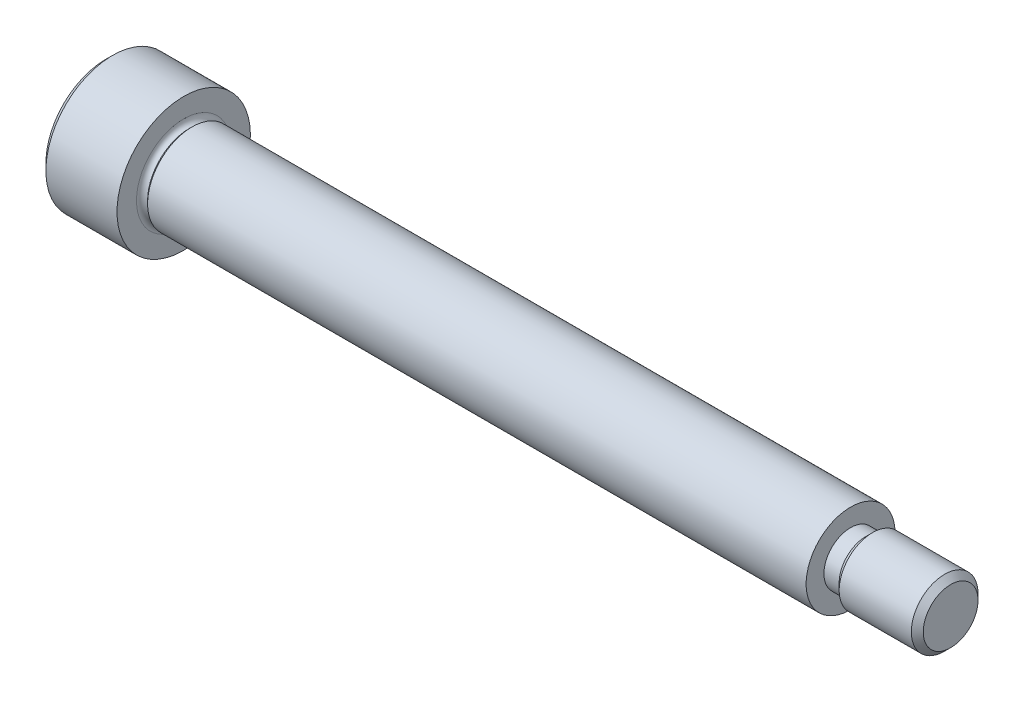
ISO-10303-21;
HEADER;
FILE_DESCRIPTION(('STEP AP214'),'2;1');
FILE_NAME('part.step','',(''),(''),'','','');
FILE_SCHEMA(('AUTOMOTIVE_DESIGN { 1 0 10303 214 1 1 1 1 }'));
ENDSEC;
DATA;
#1=APPLICATION_CONTEXT('core data for automotive mechanical design processes');
#2=APPLICATION_PROTOCOL_DEFINITION('international standard','automotive_design',2000,#1);
#3=PRODUCT_CONTEXT('',#1,'mechanical');
#4=PRODUCT('Part','Part','',(#3));
#5=PRODUCT_RELATED_PRODUCT_CATEGORY('part','',(#4));
#6=PRODUCT_DEFINITION_FORMATION('','',#4);
#7=PRODUCT_DEFINITION_CONTEXT('part definition',#1,'design');
#8=PRODUCT_DEFINITION('design','',#6,#7);
#9=PRODUCT_DEFINITION_SHAPE('','',#8);
#10=(LENGTH_UNIT() NAMED_UNIT(*) SI_UNIT(.MILLI.,.METRE.));
#11=(NAMED_UNIT(*) PLANE_ANGLE_UNIT() SI_UNIT($,.RADIAN.));
#12=(NAMED_UNIT(*) SI_UNIT($,.STERADIAN.) SOLID_ANGLE_UNIT());
#13=UNCERTAINTY_MEASURE_WITH_UNIT(LENGTH_MEASURE(1.E-05),#10,'distance_accuracy_value','');
#14=(GEOMETRIC_REPRESENTATION_CONTEXT(3) GLOBAL_UNCERTAINTY_ASSIGNED_CONTEXT((#13)) GLOBAL_UNIT_ASSIGNED_CONTEXT((#10,
#11,#12)) REPRESENTATION_CONTEXT('',''));
#15=CARTESIAN_POINT('',(0.,0.,0.));
#16=DIRECTION('',(0.,0.,1.));
#17=DIRECTION('',(1.,0.,0.));
#18=AXIS2_PLACEMENT_3D('',#15,#16,#17);
#19=CARTESIAN_POINT('',(-7.00000000006185,0.,0.));
#20=DIRECTION('',(-1.,0.,0.));
#21=DIRECTION('',(0.,0.,1.));
#22=AXIS2_PLACEMENT_3D('',#19,#20,#21);
#23=CONICAL_SURFACE('',#22,4.99999999999545,1.04719755118672);
#24=CARTESIAN_POINT('',(-4.1132486540505,0.,0.));
#25=VERTEX_POINT('',#24);
#26=VERTEX_LOOP('',#25);
#27=FACE_BOUND('',#26,.T.);
#28=CARTESIAN_POINT('',(-7.00000000006185,0.,0.));
#29=DIRECTION('',(-1.,0.,0.));
#30=DIRECTION('',(0.,0.,1.));
#31=AXIS2_PLACEMENT_3D('',#28,#29,#30);
#32=CIRCLE('',#31,4.99999999999545);
#33=CARTESIAN_POINT('',(-7.00000000003092,-4.33012701892023,2.49999999999886));
#34=VERTEX_POINT('',#33);
#35=CARTESIAN_POINT('',(-7.00000000003092,0.,4.99999999999773));
#36=VERTEX_POINT('',#35);
#37=EDGE_CURVE('E88',#34,#36,#32,.T.);
#38=ORIENTED_EDGE('',*,*,#37,.T.);
#39=CARTESIAN_POINT('',(-7.00000000006185,0.,0.));
#40=DIRECTION('',(-1.,0.,0.));
#41=DIRECTION('',(0.,0.,1.));
#42=AXIS2_PLACEMENT_3D('',#39,#40,#41);
#43=CIRCLE('',#42,4.99999999999545);
#44=CARTESIAN_POINT('',(-7.00000000003092,4.33012701892023,2.49999999999886));
#45=VERTEX_POINT('',#44);
#46=EDGE_CURVE('E19',#36,#45,#43,.T.);
#47=ORIENTED_EDGE('',*,*,#46,.T.);
#48=CARTESIAN_POINT('',(-7.00000000006185,0.,0.));
#49=DIRECTION('',(-1.,0.,0.));
#50=DIRECTION('',(0.,0.,1.));
#51=AXIS2_PLACEMENT_3D('',#48,#49,#50);
#52=CIRCLE('',#51,4.99999999999545);
#53=CARTESIAN_POINT('',(-7.00000000003092,4.33012701892023,-2.49999999999886));
#54=VERTEX_POINT('',#53);
#55=EDGE_CURVE('E93',#45,#54,#52,.T.);
#56=ORIENTED_EDGE('',*,*,#55,.T.);
#57=CARTESIAN_POINT('',(-7.00000000006185,0.,0.));
#58=DIRECTION('',(-1.,0.,0.));
#59=DIRECTION('',(0.,0.,1.));
#60=AXIS2_PLACEMENT_3D('',#57,#58,#59);
#61=CIRCLE('',#60,4.99999999999545);
#62=CARTESIAN_POINT('',(-7.00000000003092,0.,-4.99999999999773));
#63=VERTEX_POINT('',#62);
#64=EDGE_CURVE('E105',#54,#63,#61,.T.);
#65=ORIENTED_EDGE('',*,*,#64,.T.);
#66=CARTESIAN_POINT('',(-7.00000000006185,0.,0.));
#67=DIRECTION('',(-1.,0.,0.));
#68=DIRECTION('',(0.,0.,1.));
#69=AXIS2_PLACEMENT_3D('',#66,#67,#68);
#70=CIRCLE('',#69,4.99999999999545);
#71=CARTESIAN_POINT('',(-7.00000000003092,-4.33012701892023,-2.49999999999886));
#72=VERTEX_POINT('',#71);
#73=EDGE_CURVE('E113',#63,#72,#70,.T.);
#74=ORIENTED_EDGE('',*,*,#73,.T.);
#75=CARTESIAN_POINT('',(-7.00000000006185,0.,0.));
#76=DIRECTION('',(-1.,0.,0.));
#77=DIRECTION('',(0.,0.,1.));
#78=AXIS2_PLACEMENT_3D('',#75,#76,#77);
#79=CIRCLE('',#78,4.99999999999545);
#80=EDGE_CURVE('E207',#72,#34,#79,.T.);
#81=ORIENTED_EDGE('',*,*,#80,.T.);
#82=EDGE_LOOP('',(#38,#47,#56,#65,#74,#81));
#83=FACE_BOUND('',#82,.T.);
#84=ADVANCED_FACE('F15',(#27,#83),#23,.F.);
#85=CARTESIAN_POINT('',(-7.,0.,0.));
#86=DIRECTION('',(1.,0.,0.));
#87=DIRECTION('',(0.,0.,-1.));
#88=AXIS2_PLACEMENT_3D('',#85,#86,#87);
#89=PLANE('',#88);
#90=DIRECTION('',(0.,-0.5,0.866025403784439));
#91=VECTOR('',#90,1.);
#92=CARTESIAN_POINT('',(-7.,2.88675134594813,5.));
#93=LINE('',#92,#91);
#94=CARTESIAN_POINT('',(-7.00000000000125,2.88675134594813,5.));
#95=VERTEX_POINT('',#94);
#96=EDGE_CURVE('E98',#95,#45,#93,.F.);
#97=ORIENTED_EDGE('',*,*,#96,.T.);
#98=ORIENTED_EDGE('',*,*,#46,.F.);
#99=DIRECTION('',(0.,1.,0.));
#100=VECTOR('',#99,1.);
#101=CARTESIAN_POINT('',(-7.0000000000025,-2.88675134594813,5.));
#102=LINE('',#101,#100);
#103=EDGE_CURVE('E100',#36,#95,#102,.T.);
#104=ORIENTED_EDGE('',*,*,#103,.T.);
#105=EDGE_LOOP('',(#97,#98,#104));
#106=FACE_BOUND('',#105,.T.);
#107=ADVANCED_FACE('F99',(#106),#89,.F.);
#108=CARTESIAN_POINT('',(-7.,0.,0.));
#109=DIRECTION('',(1.,0.,0.));
#110=DIRECTION('',(0.,0.,-1.));
#111=AXIS2_PLACEMENT_3D('',#108,#109,#110);
#112=PLANE('',#111);
#113=DIRECTION('',(0.,1.,0.));
#114=VECTOR('',#113,1.);
#115=CARTESIAN_POINT('',(-7.,-2.88675134594813,5.));
#116=LINE('',#115,#114);
#117=CARTESIAN_POINT('',(-7.00000000000125,-2.88675134595108,5.));
#118=VERTEX_POINT('',#117);
#119=EDGE_CURVE('E118',#118,#36,#116,.T.);
#120=ORIENTED_EDGE('',*,*,#119,.T.);
#121=ORIENTED_EDGE('',*,*,#37,.F.);
#122=DIRECTION('',(0.,-0.5,-0.866025403784439));
#123=VECTOR('',#122,1.);
#124=CARTESIAN_POINT('',(-7.0000000000025,-5.77350269189626,0.));
#125=LINE('',#124,#123);
#126=EDGE_CURVE('E163',#34,#118,#125,.F.);
#127=ORIENTED_EDGE('',*,*,#126,.T.);
#128=EDGE_LOOP('',(#120,#121,#127));
#129=FACE_BOUND('',#128,.T.);
#130=ADVANCED_FACE('F218',(#129),#112,.F.);
#131=CARTESIAN_POINT('',(-7.,0.,0.));
#132=DIRECTION('',(1.,0.,0.));
#133=DIRECTION('',(0.,0.,-1.));
#134=AXIS2_PLACEMENT_3D('',#131,#132,#133);
#135=PLANE('',#134);
#136=DIRECTION('',(0.,-0.5,-0.866025403784439));
#137=VECTOR('',#136,1.);
#138=CARTESIAN_POINT('',(-7.,-5.77350269189626,0.));
#139=LINE('',#138,#137);
#140=CARTESIAN_POINT('',(-7.00000000000125,-5.77350269189626,0.));
#141=VERTEX_POINT('',#140);
#142=EDGE_CURVE('E160',#141,#34,#139,.F.);
#143=ORIENTED_EDGE('',*,*,#142,.T.);
#144=ORIENTED_EDGE('',*,*,#80,.F.);
#145=DIRECTION('',(0.,0.5,-0.866025403784439));
#146=VECTOR('',#145,1.);
#147=CARTESIAN_POINT('',(-7.0000000000025,-2.88675134594813,-5.));
#148=LINE('',#147,#146);
#149=EDGE_CURVE('E149',#72,#141,#148,.F.);
#150=ORIENTED_EDGE('',*,*,#149,.T.);
#151=EDGE_LOOP('',(#143,#144,#150));
#152=FACE_BOUND('',#151,.T.);
#153=ADVANCED_FACE('F213',(#152),#135,.F.);
#154=CARTESIAN_POINT('',(-7.,0.,0.));
#155=DIRECTION('',(1.,0.,0.));
#156=DIRECTION('',(0.,0.,-1.));
#157=AXIS2_PLACEMENT_3D('',#154,#155,#156);
#158=PLANE('',#157);
#159=DIRECTION('',(0.,0.5,-0.866025403784439));
#160=VECTOR('',#159,1.);
#161=CARTESIAN_POINT('',(-7.,-2.88675134594813,-5.));
#162=LINE('',#161,#160);
#163=CARTESIAN_POINT('',(-7.00000000000125,-2.88675134594813,-5.));
#164=VERTEX_POINT('',#163);
#165=EDGE_CURVE('E146',#164,#72,#162,.F.);
#166=ORIENTED_EDGE('',*,*,#165,.T.);
#167=ORIENTED_EDGE('',*,*,#73,.F.);
#168=DIRECTION('',(0.,1.,0.));
#169=VECTOR('',#168,1.);
#170=CARTESIAN_POINT('',(-7.0000000000025,2.88675134594813,-5.));
#171=LINE('',#170,#169);
#172=EDGE_CURVE('E140',#63,#164,#171,.F.);
#173=ORIENTED_EDGE('',*,*,#172,.T.);
#174=EDGE_LOOP('',(#166,#167,#173));
#175=FACE_BOUND('',#174,.T.);
#176=ADVANCED_FACE('F264',(#175),#158,.F.);
#177=CARTESIAN_POINT('',(-7.,0.,0.));
#178=DIRECTION('',(1.,0.,0.));
#179=DIRECTION('',(0.,0.,-1.));
#180=AXIS2_PLACEMENT_3D('',#177,#178,#179);
#181=PLANE('',#180);
#182=DIRECTION('',(0.,0.5,0.866025403784439));
#183=VECTOR('',#182,1.);
#184=CARTESIAN_POINT('',(-7.,5.77350269189626,0.));
#185=LINE('',#184,#183);
#186=CARTESIAN_POINT('',(-7.00000000000083,5.77350269189626,0.));
#187=VERTEX_POINT('',#186);
#188=EDGE_CURVE('E111',#187,#54,#185,.F.);
#189=ORIENTED_EDGE('',*,*,#188,.T.);
#190=ORIENTED_EDGE('',*,*,#55,.F.);
#191=DIRECTION('',(0.,-0.5,0.866025403784439));
#192=VECTOR('',#191,1.);
#193=CARTESIAN_POINT('',(-7.0000000000025,2.88675134594813,5.));
#194=LINE('',#193,#192);
#195=EDGE_CURVE('E104',#45,#187,#194,.F.);
#196=ORIENTED_EDGE('',*,*,#195,.T.);
#197=EDGE_LOOP('',(#189,#190,#196));
#198=FACE_BOUND('',#197,.T.);
#199=ADVANCED_FACE('F108',(#198),#181,.F.);
#200=CARTESIAN_POINT('',(-7.,0.,0.));
#201=DIRECTION('',(1.,0.,0.));
#202=DIRECTION('',(0.,0.,-1.));
#203=AXIS2_PLACEMENT_3D('',#200,#201,#202);
#204=PLANE('',#203);
#205=DIRECTION('',(0.,1.,0.));
#206=VECTOR('',#205,1.);
#207=CARTESIAN_POINT('',(-7.,2.88675134594813,-5.));
#208=LINE('',#207,#206);
#209=CARTESIAN_POINT('',(-7.00000000000125,2.88675134595108,-5.));
#210=VERTEX_POINT('',#209);
#211=EDGE_CURVE('E143',#210,#63,#208,.F.);
#212=ORIENTED_EDGE('',*,*,#211,.T.);
#213=ORIENTED_EDGE('',*,*,#64,.F.);
#214=DIRECTION('',(0.,0.5,0.866025403784439));
#215=VECTOR('',#214,1.);
#216=CARTESIAN_POINT('',(-7.0000000000025,5.77350269189626,0.));
#217=LINE('',#216,#215);
#218=EDGE_CURVE('E248',#54,#210,#217,.F.);
#219=ORIENTED_EDGE('',*,*,#218,.T.);
#220=EDGE_LOOP('',(#212,#213,#219));
#221=FACE_BOUND('',#220,.T.);
#222=ADVANCED_FACE('F261',(#221),#204,.F.);
#223=CARTESIAN_POINT('',(-14.,2.88675134594813,5.));
#224=DIRECTION('',(0.,0.866025403784439,0.5));
#225=DIRECTION('',(0.,-0.5,0.866025403784439));
#226=AXIS2_PLACEMENT_3D('',#223,#224,#225);
#227=PLANE('',#226);
#228=ORIENTED_EDGE('',*,*,#195,.F.);
#229=ORIENTED_EDGE('',*,*,#96,.F.);
#230=DIRECTION('',(1.,0.,0.));
#231=VECTOR('',#230,1.);
#232=CARTESIAN_POINT('',(-14.,2.88675134594813,5.));
#233=LINE('',#232,#231);
#234=CARTESIAN_POINT('',(-14.,2.88675134594813,5.));
#235=VERTEX_POINT('',#234);
#236=EDGE_CURVE('E164',#95,#235,#233,.F.);
#237=ORIENTED_EDGE('',*,*,#236,.T.);
#238=DIRECTION('',(0.,-0.5,0.866025403784439));
#239=VECTOR('',#238,1.);
#240=CARTESIAN_POINT('',(-14.,5.77350269189626,0.));
#241=LINE('',#240,#239);
#242=CARTESIAN_POINT('',(-14.,5.77350269189626,0.));
#243=VERTEX_POINT('',#242);
#244=EDGE_CURVE('E127',#243,#235,#241,.T.);
#245=ORIENTED_EDGE('',*,*,#244,.F.);
#246=DIRECTION('',(1.,0.,0.));
#247=VECTOR('',#246,1.);
#248=CARTESIAN_POINT('',(-14.,5.77350269189626,0.));
#249=LINE('',#248,#247);
#250=EDGE_CURVE('E117',#243,#187,#249,.T.);
#251=ORIENTED_EDGE('',*,*,#250,.T.);
#252=EDGE_LOOP('',(#228,#229,#237,#245,#251));
#253=FACE_BOUND('',#252,.T.);
#254=ADVANCED_FACE('F115',(#253),#227,.F.);
#255=CARTESIAN_POINT('',(-14.,-2.88675134594813,5.));
#256=DIRECTION('',(0.,0.,1.));
#257=DIRECTION('',(1.,0.,0.));
#258=AXIS2_PLACEMENT_3D('',#255,#256,#257);
#259=PLANE('',#258);
#260=ORIENTED_EDGE('',*,*,#103,.F.);
#261=ORIENTED_EDGE('',*,*,#119,.F.);
#262=DIRECTION('',(1.,0.,0.));
#263=VECTOR('',#262,1.);
#264=CARTESIAN_POINT('',(-14.,-2.88675134594813,5.));
#265=LINE('',#264,#263);
#266=CARTESIAN_POINT('',(-14.,-2.88675134594813,5.));
#267=VERTEX_POINT('',#266);
#268=EDGE_CURVE('E150',#118,#267,#265,.F.);
#269=ORIENTED_EDGE('',*,*,#268,.T.);
#270=DIRECTION('',(0.,1.,0.));
#271=VECTOR('',#270,1.);
#272=CARTESIAN_POINT('',(-14.,7.9,5.));
#273=LINE('',#272,#271);
#274=EDGE_CURVE('E130',#235,#267,#273,.F.);
#275=ORIENTED_EDGE('',*,*,#274,.F.);
#276=ORIENTED_EDGE('',*,*,#236,.F.);
#277=EDGE_LOOP('',(#260,#261,#269,#275,#276));
#278=FACE_BOUND('',#277,.T.);
#279=ADVANCED_FACE('F228',(#278),#259,.F.);
#280=CARTESIAN_POINT('',(-14.,-5.77350269189626,0.));
#281=DIRECTION('',(0.,-0.866025403784439,0.5));
#282=DIRECTION('',(0.,-0.5,-0.866025403784439));
#283=AXIS2_PLACEMENT_3D('',#280,#281,#282);
#284=PLANE('',#283);
#285=ORIENTED_EDGE('',*,*,#126,.F.);
#286=ORIENTED_EDGE('',*,*,#142,.F.);
#287=DIRECTION('',(1.,0.,0.));
#288=VECTOR('',#287,1.);
#289=CARTESIAN_POINT('',(-14.,-5.77350269189626,0.));
#290=LINE('',#289,#288);
#291=CARTESIAN_POINT('',(-14.,-5.77350269189626,0.));
#292=VERTEX_POINT('',#291);
#293=EDGE_CURVE('E157',#141,#292,#290,.F.);
#294=ORIENTED_EDGE('',*,*,#293,.T.);
#295=DIRECTION('',(0.,-0.5,-0.866025403784439));
#296=VECTOR('',#295,1.);
#297=CARTESIAN_POINT('',(-14.,-2.88675134594813,5.));
#298=LINE('',#297,#296);
#299=EDGE_CURVE('E224',#267,#292,#298,.T.);
#300=ORIENTED_EDGE('',*,*,#299,.F.);
#301=ORIENTED_EDGE('',*,*,#268,.F.);
#302=EDGE_LOOP('',(#285,#286,#294,#300,#301));
#303=FACE_BOUND('',#302,.T.);
#304=ADVANCED_FACE('F221',(#303),#284,.F.);
#305=CARTESIAN_POINT('',(-14.,-2.88675134594813,-5.));
#306=DIRECTION('',(0.,-0.866025403784439,-0.5));
#307=DIRECTION('',(0.,0.5,-0.866025403784439));
#308=AXIS2_PLACEMENT_3D('',#305,#306,#307);
#309=PLANE('',#308);
#310=ORIENTED_EDGE('',*,*,#149,.F.);
#311=ORIENTED_EDGE('',*,*,#165,.F.);
#312=DIRECTION('',(-1.,0.,0.));
#313=VECTOR('',#312,1.);
#314=CARTESIAN_POINT('',(-14.,-2.88675134594813,-5.));
#315=LINE('',#314,#313);
#316=CARTESIAN_POINT('',(-14.,-2.88675134594813,-5.));
#317=VERTEX_POINT('',#316);
#318=EDGE_CURVE('E142',#164,#317,#315,.T.);
#319=ORIENTED_EDGE('',*,*,#318,.T.);
#320=DIRECTION('',(0.,0.5,-0.866025403784439));
#321=VECTOR('',#320,1.);
#322=CARTESIAN_POINT('',(-14.,-5.77350269189626,0.));
#323=LINE('',#322,#321);
#324=EDGE_CURVE('E238',#292,#317,#323,.T.);
#325=ORIENTED_EDGE('',*,*,#324,.F.);
#326=ORIENTED_EDGE('',*,*,#293,.F.);
#327=EDGE_LOOP('',(#310,#311,#319,#325,#326));
#328=FACE_BOUND('',#327,.T.);
#329=ADVANCED_FACE('F268',(#328),#309,.F.);
#330=CARTESIAN_POINT('',(-14.,2.88675134594813,-5.));
#331=DIRECTION('',(0.,0.,-1.));
#332=DIRECTION('',(-1.,0.,0.));
#333=AXIS2_PLACEMENT_3D('',#330,#331,#332);
#334=PLANE('',#333);
#335=ORIENTED_EDGE('',*,*,#172,.F.);
#336=ORIENTED_EDGE('',*,*,#211,.F.);
#337=DIRECTION('',(1.,0.,0.));
#338=VECTOR('',#337,1.);
#339=CARTESIAN_POINT('',(-14.,2.88675134594813,-5.));
#340=LINE('',#339,#338);
#341=CARTESIAN_POINT('',(-14.,2.88675134594813,-5.));
#342=VERTEX_POINT('',#341);
#343=EDGE_CURVE('E34',#210,#342,#340,.F.);
#344=ORIENTED_EDGE('',*,*,#343,.T.);
#345=DIRECTION('',(0.,1.,0.));
#346=VECTOR('',#345,1.);
#347=CARTESIAN_POINT('',(-14.,7.9,-5.));
#348=LINE('',#347,#346);
#349=EDGE_CURVE('E137',#317,#342,#348,.T.);
#350=ORIENTED_EDGE('',*,*,#349,.F.);
#351=ORIENTED_EDGE('',*,*,#318,.F.);
#352=EDGE_LOOP('',(#335,#336,#344,#350,#351));
#353=FACE_BOUND('',#352,.T.);
#354=ADVANCED_FACE('F266',(#353),#334,.F.);
#355=CARTESIAN_POINT('',(-14.,5.77350269189626,0.));
#356=DIRECTION('',(0.,0.866025403784439,-0.5));
#357=DIRECTION('',(0.,0.5,0.866025403784439));
#358=AXIS2_PLACEMENT_3D('',#355,#356,#357);
#359=PLANE('',#358);
#360=ORIENTED_EDGE('',*,*,#218,.F.);
#361=ORIENTED_EDGE('',*,*,#188,.F.);
#362=ORIENTED_EDGE('',*,*,#250,.F.);
#363=DIRECTION('',(0.,0.5,0.866025403784439));
#364=VECTOR('',#363,1.);
#365=CARTESIAN_POINT('',(-14.,2.88675134594813,-5.));
#366=LINE('',#365,#364);
#367=EDGE_CURVE('E133',#342,#243,#366,.T.);
#368=ORIENTED_EDGE('',*,*,#367,.F.);
#369=ORIENTED_EDGE('',*,*,#343,.F.);
#370=EDGE_LOOP('',(#360,#361,#362,#368,#369));
#371=FACE_BOUND('',#370,.T.);
#372=ADVANCED_FACE('F232',(#371),#359,.F.);
#373=CARTESIAN_POINT('',(-14.,7.9,0.));
#374=DIRECTION('',(-1.,0.,0.));
#375=DIRECTION('',(0.,0.,1.));
#376=AXIS2_PLACEMENT_3D('',#373,#374,#375);
#377=PLANE('',#376);
#378=ORIENTED_EDGE('',*,*,#349,.T.);
#379=ORIENTED_EDGE('',*,*,#367,.T.);
#380=ORIENTED_EDGE('',*,*,#244,.T.);
#381=ORIENTED_EDGE('',*,*,#274,.T.);
#382=ORIENTED_EDGE('',*,*,#299,.T.);
#383=ORIENTED_EDGE('',*,*,#324,.T.);
#384=EDGE_LOOP('',(#378,#379,#380,#381,#382,#383));
#385=FACE_BOUND('',#384,.T.);
#386=CARTESIAN_POINT('',(-14.,0.,0.));
#387=DIRECTION('',(1.,0.,0.));
#388=DIRECTION('',(0.,0.,-1.));
#389=AXIS2_PLACEMENT_3D('',#386,#387,#388);
#390=CIRCLE('',#389,10.8);
#391=CARTESIAN_POINT('',(-14.,0.,-10.8));
#392=VERTEX_POINT('',#391);
#393=EDGE_CURVE('E136',#392,#392,#390,.T.);
#394=ORIENTED_EDGE('',*,*,#393,.F.);
#395=EDGE_LOOP('',(#394));
#396=FACE_BOUND('',#395,.T.);
#397=ADVANCED_FACE('F234',(#385,#396),#377,.T.);
#398=CARTESIAN_POINT('',(138.,2.46325,0.));
#399=DIRECTION('',(1.,0.,0.));
#400=DIRECTION('',(0.,0.,-1.));
#401=AXIS2_PLACEMENT_3D('',#398,#399,#400);
#402=PLANE('',#401);
#403=CARTESIAN_POINT('',(137.999999999977,0.,0.));
#404=DIRECTION('',(-1.,0.,0.));
#405=DIRECTION('',(0.,0.,1.));
#406=AXIS2_PLACEMENT_3D('',#403,#404,#405);
#407=CIRCLE('',#406,4.92650000001049);
#408=CARTESIAN_POINT('',(137.999999999977,0.,4.92650000001049));
#409=VERTEX_POINT('',#408);
#410=EDGE_CURVE('E199',#409,#409,#407,.T.);
#411=ORIENTED_EDGE('',*,*,#410,.F.);
#412=EDGE_LOOP('',(#411));
#413=FACE_BOUND('',#412,.T.);
#414=ADVANCED_FACE('F323',(#413),#402,.T.);
#415=CARTESIAN_POINT('',(-12.8,0.,0.));
#416=DIRECTION('',(1.,0.,0.));
#417=DIRECTION('',(0.,0.,-1.));
#418=AXIS2_PLACEMENT_3D('',#415,#416,#417);
#419=CONICAL_SURFACE('',#418,12.,0.785398163397448);
#420=ORIENTED_EDGE('',*,*,#393,.T.);
#421=EDGE_LOOP('',(#420));
#422=FACE_BOUND('',#421,.T.);
#423=CARTESIAN_POINT('',(-12.8,0.,0.));
#424=DIRECTION('',(1.,0.,0.));
#425=DIRECTION('',(0.,0.,-1.));
#426=AXIS2_PLACEMENT_3D('',#423,#424,#425);
#427=CIRCLE('',#426,12.);
#428=CARTESIAN_POINT('',(-12.8,0.,-12.));
#429=VERTEX_POINT('',#428);
#430=EDGE_CURVE('E202',#429,#429,#427,.T.);
#431=ORIENTED_EDGE('',*,*,#430,.F.);
#432=EDGE_LOOP('',(#431));
#433=FACE_BOUND('',#432,.T.);
#434=ADVANCED_FACE('F319',(#422,#433),#419,.T.);
#435=CARTESIAN_POINT('',(136.926500000072,0.,0.));
#436=DIRECTION('',(-1.,0.,0.));
#437=DIRECTION('',(0.,0.,1.));
#438=AXIS2_PLACEMENT_3D('',#435,#436,#437);
#439=CONICAL_SURFACE('',#438,5.99999999991496,0.785398163397448);
#440=CARTESIAN_POINT('',(136.9265,0.,0.));
#441=DIRECTION('',(1.,0.,0.));
#442=DIRECTION('',(0.,0.,-1.));
#443=AXIS2_PLACEMENT_3D('',#440,#441,#442);
#444=CIRCLE('',#443,6.);
#445=CARTESIAN_POINT('',(136.9265,0.,-6.));
#446=VERTEX_POINT('',#445);
#447=EDGE_CURVE('E198',#446,#446,#444,.F.);
#448=ORIENTED_EDGE('',*,*,#447,.F.);
#449=EDGE_LOOP('',(#448));
#450=FACE_BOUND('',#449,.T.);
#451=ORIENTED_EDGE('',*,*,#410,.T.);
#452=EDGE_LOOP('',(#451));
#453=FACE_BOUND('',#452,.T.);
#454=ADVANCED_FACE('F315',(#450,#453),#439,.T.);
#455=CARTESIAN_POINT('',(-6.4,0.,0.));
#456=DIRECTION('',(1.,0.,0.));
#457=DIRECTION('',(0.,0.,-1.));
#458=AXIS2_PLACEMENT_3D('',#455,#456,#457);
#459=CYLINDRICAL_SURFACE('',#458,12.);
#460=ORIENTED_EDGE('',*,*,#430,.T.);
#461=EDGE_LOOP('',(#460));
#462=FACE_BOUND('',#461,.T.);
#463=CARTESIAN_POINT('',(0.,0.,0.));
#464=DIRECTION('',(1.,0.,0.));
#465=DIRECTION('',(0.,0.,-1.));
#466=AXIS2_PLACEMENT_3D('',#463,#464,#465);
#467=CIRCLE('',#466,12.);
#468=CARTESIAN_POINT('',(0.,0.,-12.));
#469=VERTEX_POINT('',#468);
#470=EDGE_CURVE('E195',#469,#469,#467,.T.);
#471=ORIENTED_EDGE('',*,*,#470,.F.);
#472=EDGE_LOOP('',(#471));
#473=FACE_BOUND('',#472,.T.);
#474=ADVANCED_FACE('F311',(#462,#473),#459,.T.);
#475=CARTESIAN_POINT('',(130.43675,0.,0.));
#476=DIRECTION('',(1.,0.,0.));
#477=DIRECTION('',(0.,0.,-1.));
#478=AXIS2_PLACEMENT_3D('',#475,#476,#477);
#479=CYLINDRICAL_SURFACE('',#478,6.);
#480=ORIENTED_EDGE('',*,*,#447,.T.);
#481=EDGE_LOOP('',(#480));
#482=FACE_BOUND('',#481,.T.);
#483=CARTESIAN_POINT('',(123.94699999993,0.,0.));
#484=DIRECTION('',(1.,0.,0.));
#485=DIRECTION('',(0.,0.,-1.));
#486=AXIS2_PLACEMENT_3D('',#483,#484,#485);
#487=CIRCLE('',#486,6.00000000002865);
#488=CARTESIAN_POINT('',(123.94699999993,0.,-6.00000000002865));
#489=VERTEX_POINT('',#488);
#490=EDGE_CURVE('E194',#489,#489,#487,.F.);
#491=ORIENTED_EDGE('',*,*,#490,.F.);
#492=EDGE_LOOP('',(#491));
#493=FACE_BOUND('',#492,.T.);
#494=ADVANCED_FACE('F307',(#482,#493),#479,.T.);
#495=CARTESIAN_POINT('',(0.,10.25,0.));
#496=DIRECTION('',(1.,0.,0.));
#497=DIRECTION('',(0.,0.,-1.));
#498=AXIS2_PLACEMENT_3D('',#495,#496,#497);
#499=PLANE('',#498);
#500=ORIENTED_EDGE('',*,*,#470,.T.);
#501=EDGE_LOOP('',(#500));
#502=FACE_BOUND('',#501,.T.);
#503=CARTESIAN_POINT('',(0.,0.,0.));
#504=DIRECTION('',(-1.,0.,0.));
#505=DIRECTION('',(0.,0.,1.));
#506=AXIS2_PLACEMENT_3D('',#503,#504,#505);
#507=CIRCLE('',#506,8.5);
#508=CARTESIAN_POINT('',(0.,0.,8.5));
#509=VERTEX_POINT('',#508);
#510=EDGE_CURVE('E190',#509,#509,#507,.T.);
#511=ORIENTED_EDGE('',*,*,#510,.T.);
#512=EDGE_LOOP('',(#511));
#513=FACE_BOUND('',#512,.T.);
#514=ADVANCED_FACE('F303',(#502,#513),#499,.T.);
#515=CARTESIAN_POINT('',(123.946999999987,0.,0.));
#516=DIRECTION('',(1.,0.,0.));
#517=DIRECTION('',(0.,0.,-1.));
#518=AXIS2_PLACEMENT_3D('',#515,#516,#517);
#519=CONICAL_SURFACE('',#518,6.00000000008549,0.785398163421133);
#520=ORIENTED_EDGE('',*,*,#490,.T.);
#521=EDGE_LOOP('',(#520));
#522=FACE_BOUND('',#521,.T.);
#523=CARTESIAN_POINT('',(122.747,0.,0.));
#524=DIRECTION('',(1.,0.,0.));
#525=DIRECTION('',(0.,0.,-1.));
#526=AXIS2_PLACEMENT_3D('',#523,#524,#525);
#527=CIRCLE('',#526,4.8);
#528=CARTESIAN_POINT('',(122.747,0.,-4.8));
#529=VERTEX_POINT('',#528);
#530=EDGE_CURVE('E193',#529,#529,#527,.F.);
#531=ORIENTED_EDGE('',*,*,#530,.F.);
#532=EDGE_LOOP('',(#531));
#533=FACE_BOUND('',#532,.T.);
#534=ADVANCED_FACE('F300',(#522,#533),#519,.T.);
#535=CARTESIAN_POINT('',(0.971585403498007,0.,0.));
#536=DIRECTION('',(-1.,0.,0.));
#537=DIRECTION('',(0.,0.,1.));
#538=AXIS2_PLACEMENT_3D('',#535,#536,#537);
#539=TOROIDAL_SURFACE('',#538,8.47161331809452,0.972);
#540=ORIENTED_EDGE('',*,*,#510,.F.);
#541=EDGE_LOOP('',(#540));
#542=FACE_BOUND('',#541,.T.);
#543=CARTESIAN_POINT('',(0.999,0.,0.));
#544=DIRECTION('',(1.,0.,0.));
#545=DIRECTION('',(0.,0.,-1.));
#546=AXIS2_PLACEMENT_3D('',#543,#544,#545);
#547=CIRCLE('',#546,7.5);
#548=CARTESIAN_POINT('',(0.999,0.,-7.5));
#549=VERTEX_POINT('',#548);
#550=EDGE_CURVE('E189',#549,#549,#547,.T.);
#551=ORIENTED_EDGE('',*,*,#550,.F.);
#552=EDGE_LOOP('',(#551));
#553=FACE_BOUND('',#552,.T.);
#554=ADVANCED_FACE('F17',(#542,#553),#539,.F.);
#555=CARTESIAN_POINT('',(121.3735,0.,0.));
#556=DIRECTION('',(1.,0.,0.));
#557=DIRECTION('',(0.,0.,-1.));
#558=AXIS2_PLACEMENT_3D('',#555,#556,#557);
#559=CYLINDRICAL_SURFACE('',#558,4.8);
#560=ORIENTED_EDGE('',*,*,#530,.T.);
#561=EDGE_LOOP('',(#560));
#562=FACE_BOUND('',#561,.T.);
#563=CARTESIAN_POINT('',(120.,0.,0.));
#564=DIRECTION('',(1.,0.,0.));
#565=DIRECTION('',(0.,0.,-1.));
#566=AXIS2_PLACEMENT_3D('',#563,#564,#565);
#567=CIRCLE('',#566,4.8);
#568=CARTESIAN_POINT('',(120.,0.,-4.8));
#569=VERTEX_POINT('',#568);
#570=EDGE_CURVE('E186',#569,#569,#567,.F.);
#571=ORIENTED_EDGE('',*,*,#570,.F.);
#572=EDGE_LOOP('',(#571));
#573=FACE_BOUND('',#572,.T.);
#574=ADVANCED_FACE('F295',(#562,#573),#559,.T.);
#575=CARTESIAN_POINT('',(1.499,0.,0.));
#576=DIRECTION('',(1.,0.,0.));
#577=DIRECTION('',(0.,1.,0.));
#578=AXIS2_PLACEMENT_3D('',#575,#576,#577);
#579=CONICAL_SURFACE('',#578,8.,0.785398163397448);
#580=CARTESIAN_POINT('',(1.499,0.,0.));
#581=DIRECTION('',(1.,0.,0.));
#582=DIRECTION('',(0.,0.,-1.));
#583=AXIS2_PLACEMENT_3D('',#580,#581,#582);
#584=CIRCLE('',#583,8.);
#585=CARTESIAN_POINT('',(1.499,0.,-8.));
#586=VERTEX_POINT('',#585);
#587=EDGE_CURVE('E25',#586,#586,#584,.T.);
#588=ORIENTED_EDGE('',*,*,#587,.F.);
#589=EDGE_LOOP('',(#588));
#590=FACE_BOUND('',#589,.T.);
#591=ORIENTED_EDGE('',*,*,#550,.T.);
#592=EDGE_LOOP('',(#591));
#593=FACE_BOUND('',#592,.T.);
#594=ADVANCED_FACE('F288',(#590,#593),#579,.T.);
#595=CARTESIAN_POINT('',(120.,6.4,0.));
#596=DIRECTION('',(1.,0.,0.));
#597=DIRECTION('',(0.,0.,-1.));
#598=AXIS2_PLACEMENT_3D('',#595,#596,#597);
#599=PLANE('',#598);
#600=CARTESIAN_POINT('',(120.,0.,0.));
#601=DIRECTION('',(1.,0.,0.));
#602=DIRECTION('',(0.,0.,-1.));
#603=AXIS2_PLACEMENT_3D('',#600,#601,#602);
#604=CIRCLE('',#603,8.);
#605=CARTESIAN_POINT('',(120.,0.,-8.));
#606=VERTEX_POINT('',#605);
#607=EDGE_CURVE('E10',#606,#606,#604,.F.);
#608=ORIENTED_EDGE('',*,*,#607,.F.);
#609=EDGE_LOOP('',(#608));
#610=FACE_BOUND('',#609,.T.);
#611=ORIENTED_EDGE('',*,*,#570,.T.);
#612=EDGE_LOOP('',(#611));
#613=FACE_BOUND('',#612,.T.);
#614=ADVANCED_FACE('F281',(#610,#613),#599,.T.);
#615=CARTESIAN_POINT('',(60.7495,0.,0.));
#616=DIRECTION('',(1.,0.,0.));
#617=DIRECTION('',(0.,0.,-1.));
#618=AXIS2_PLACEMENT_3D('',#615,#616,#617);
#619=CYLINDRICAL_SURFACE('',#618,8.);
#620=ORIENTED_EDGE('',*,*,#607,.T.);
#621=EDGE_LOOP('',(#620));
#622=FACE_BOUND('',#621,.T.);
#623=ORIENTED_EDGE('',*,*,#587,.T.);
#624=EDGE_LOOP('',(#623));
#625=FACE_BOUND('',#624,.T.);
#626=ADVANCED_FACE('F279',(#622,#625),#619,.T.);
#627=CLOSED_SHELL('',(#84,#107,#130,#153,#176,#199,#222,#254,#279,#304,#329,#354,#372,#397,#414,
#434,#454,#474,#494,#514,#534,#554,#574,#594,#614,#626));
#628=MANIFOLD_SOLID_BREP('B1',#627);
#629=ADVANCED_BREP_SHAPE_REPRESENTATION('',(#18,#628),#14);
#630=SHAPE_DEFINITION_REPRESENTATION(#9,#629);
ENDSEC;
END-ISO-10303-21;
